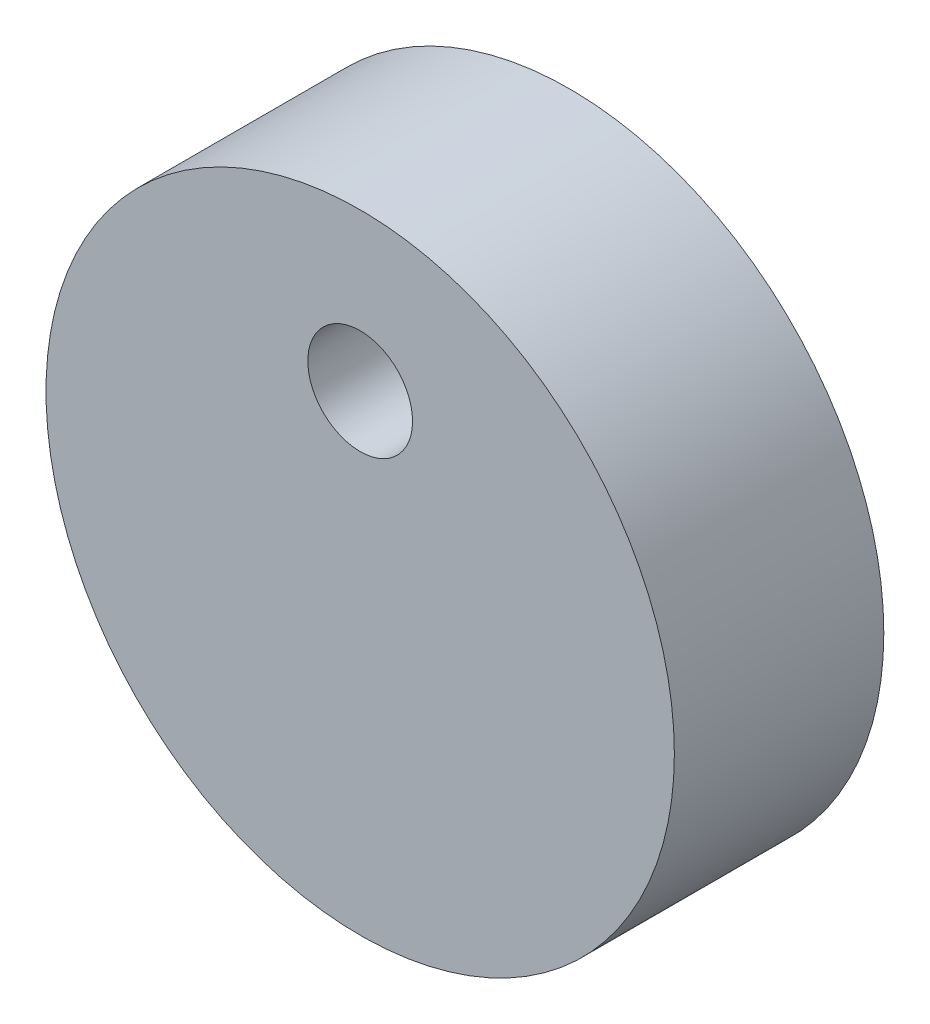
ISO-10303-21;
HEADER;
FILE_DESCRIPTION(('STEP AP214'),'2;1');
FILE_NAME('part.step','',(''),(''),'','','');
FILE_SCHEMA(('AUTOMOTIVE_DESIGN { 1 0 10303 214 1 1 1 1 }'));
ENDSEC;
DATA;
#1=APPLICATION_CONTEXT('core data for automotive mechanical design processes');
#2=APPLICATION_PROTOCOL_DEFINITION('international standard','automotive_design',2000,#1);
#3=PRODUCT_CONTEXT('',#1,'mechanical');
#4=PRODUCT('Part','Part','',(#3));
#5=PRODUCT_RELATED_PRODUCT_CATEGORY('part','',(#4));
#6=PRODUCT_DEFINITION_FORMATION('','',#4);
#7=PRODUCT_DEFINITION_CONTEXT('part definition',#1,'design');
#8=PRODUCT_DEFINITION('design','',#6,#7);
#9=PRODUCT_DEFINITION_SHAPE('','',#8);
#10=(LENGTH_UNIT() NAMED_UNIT(*) SI_UNIT(.MILLI.,.METRE.));
#11=(NAMED_UNIT(*) PLANE_ANGLE_UNIT() SI_UNIT($,.RADIAN.));
#12=(NAMED_UNIT(*) SI_UNIT($,.STERADIAN.) SOLID_ANGLE_UNIT());
#13=UNCERTAINTY_MEASURE_WITH_UNIT(LENGTH_MEASURE(1.E-05),#10,'distance_accuracy_value','');
#14=(GEOMETRIC_REPRESENTATION_CONTEXT(3) GLOBAL_UNCERTAINTY_ASSIGNED_CONTEXT((#13)) GLOBAL_UNIT_ASSIGNED_CONTEXT((#10,
#11,#12)) REPRESENTATION_CONTEXT('',''));
#15=CARTESIAN_POINT('',(0.,0.,0.));
#16=DIRECTION('',(0.,0.,1.));
#17=DIRECTION('',(1.,0.,0.));
#18=AXIS2_PLACEMENT_3D('',#15,#16,#17);
#19=CARTESIAN_POINT('',(0.,0.,25.4));
#20=DIRECTION('',(0.,0.,-1.));
#21=DIRECTION('',(-1.,0.,0.));
#22=AXIS2_PLACEMENT_3D('',#19,#20,#21);
#23=CYLINDRICAL_SURFACE('',#22,38.1);
#24=CARTESIAN_POINT('',(0.,0.,25.4));
#25=DIRECTION('',(0.,0.,1.));
#26=DIRECTION('',(1.,0.,0.));
#27=AXIS2_PLACEMENT_3D('',#24,#25,#26);
#28=CIRCLE('',#27,38.1);
#29=CARTESIAN_POINT('',(38.1,0.,25.4));
#30=VERTEX_POINT('',#29);
#31=EDGE_CURVE('E10',#30,#30,#28,.T.);
#32=ORIENTED_EDGE('',*,*,#31,.F.);
#33=EDGE_LOOP('',(#32));
#34=FACE_BOUND('',#33,.T.);
#35=CARTESIAN_POINT('',(0.,0.,0.));
#36=DIRECTION('',(0.,0.,1.));
#37=DIRECTION('',(1.,0.,0.));
#38=AXIS2_PLACEMENT_3D('',#35,#36,#37);
#39=CIRCLE('',#38,38.1);
#40=CARTESIAN_POINT('',(38.1,0.,0.));
#41=VERTEX_POINT('',#40);
#42=EDGE_CURVE('E40',#41,#41,#39,.T.);
#43=ORIENTED_EDGE('',*,*,#42,.T.);
#44=EDGE_LOOP('',(#43));
#45=FACE_BOUND('',#44,.T.);
#46=ADVANCED_FACE('F33',(#34,#45),#23,.T.);
#47=CARTESIAN_POINT('',(0.,0.,25.4));
#48=DIRECTION('',(0.,0.,1.));
#49=DIRECTION('',(1.,0.,0.));
#50=AXIS2_PLACEMENT_3D('',#47,#48,#49);
#51=PLANE('',#50);
#52=CARTESIAN_POINT('',(0.,19.05,25.4));
#53=DIRECTION('',(0.,0.,1.));
#54=DIRECTION('',(1.,0.,0.));
#55=AXIS2_PLACEMENT_3D('',#52,#53,#54);
#56=CIRCLE('',#55,6.35);
#57=CARTESIAN_POINT('',(6.35,19.05,25.4));
#58=VERTEX_POINT('',#57);
#59=EDGE_CURVE('E46',#58,#58,#56,.T.);
#60=ORIENTED_EDGE('',*,*,#59,.F.);
#61=EDGE_LOOP('',(#60));
#62=FACE_BOUND('',#61,.T.);
#63=ORIENTED_EDGE('',*,*,#31,.T.);
#64=EDGE_LOOP('',(#63));
#65=FACE_BOUND('',#64,.T.);
#66=ADVANCED_FACE('F62',(#62,#65),#51,.T.);
#67=CARTESIAN_POINT('',(0.,0.,0.));
#68=DIRECTION('',(0.,0.,1.));
#69=DIRECTION('',(1.,0.,0.));
#70=AXIS2_PLACEMENT_3D('',#67,#68,#69);
#71=PLANE('',#70);
#72=CARTESIAN_POINT('',(0.,19.05,0.));
#73=DIRECTION('',(0.,0.,1.));
#74=DIRECTION('',(1.,0.,0.));
#75=AXIS2_PLACEMENT_3D('',#72,#73,#74);
#76=CIRCLE('',#75,6.35);
#77=CARTESIAN_POINT('',(6.35,19.05,0.));
#78=VERTEX_POINT('',#77);
#79=EDGE_CURVE('E36',#78,#78,#76,.T.);
#80=ORIENTED_EDGE('',*,*,#79,.T.);
#81=EDGE_LOOP('',(#80));
#82=FACE_BOUND('',#81,.T.);
#83=ORIENTED_EDGE('',*,*,#42,.F.);
#84=EDGE_LOOP('',(#83));
#85=FACE_BOUND('',#84,.T.);
#86=ADVANCED_FACE('F53',(#82,#85),#71,.F.);
#87=CARTESIAN_POINT('',(0.,19.05,-50.8));
#88=DIRECTION('',(0.,0.,1.));
#89=DIRECTION('',(1.,0.,0.));
#90=AXIS2_PLACEMENT_3D('',#87,#88,#89);
#91=CYLINDRICAL_SURFACE('',#90,6.35);
#92=CARTESIAN_POINT('',(6.35,19.05,25.4));
#93=CARTESIAN_POINT('',(6.35,19.05,25.1354166666667));
#94=CARTESIAN_POINT('',(6.35,19.05,24.8708333333333));
#95=CARTESIAN_POINT('',(6.35,19.05,24.3416666666667));
#96=CARTESIAN_POINT('',(6.35,19.05,24.0770833333333));
#97=CARTESIAN_POINT('',(6.35,19.05,23.5479166666667));
#98=CARTESIAN_POINT('',(6.35,19.05,23.2833333333333));
#99=CARTESIAN_POINT('',(6.35,19.05,22.7541666666667));
#100=CARTESIAN_POINT('',(6.35,19.05,22.4895833333333));
#101=CARTESIAN_POINT('',(6.35,19.05,21.9604166666667));
#102=CARTESIAN_POINT('',(6.35,19.05,21.6958333333333));
#103=CARTESIAN_POINT('',(6.35,19.05,21.1666666666667));
#104=CARTESIAN_POINT('',(6.35,19.05,20.9020833333333));
#105=CARTESIAN_POINT('',(6.35,19.05,20.3729166666667));
#106=CARTESIAN_POINT('',(6.35,19.05,20.1083333333333));
#107=CARTESIAN_POINT('',(6.35,19.05,19.5791666666667));
#108=CARTESIAN_POINT('',(6.35,19.05,19.3145833333333));
#109=CARTESIAN_POINT('',(6.35,19.05,18.7854166666667));
#110=CARTESIAN_POINT('',(6.35,19.05,18.5208333333333));
#111=CARTESIAN_POINT('',(6.35,19.05,17.9916666666667));
#112=CARTESIAN_POINT('',(6.35,19.05,17.7270833333333));
#113=CARTESIAN_POINT('',(6.35,19.05,17.1979166666667));
#114=CARTESIAN_POINT('',(6.35,19.05,16.9333333333333));
#115=CARTESIAN_POINT('',(6.35,19.05,16.4041666666667));
#116=CARTESIAN_POINT('',(6.35,19.05,16.1395833333333));
#117=CARTESIAN_POINT('',(6.35,19.05,15.6104166666667));
#118=CARTESIAN_POINT('',(6.35,19.05,15.3458333333333));
#119=CARTESIAN_POINT('',(6.35,19.05,14.8166666666667));
#120=CARTESIAN_POINT('',(6.35,19.05,14.5520833333333));
#121=CARTESIAN_POINT('',(6.35,19.05,14.0229166666667));
#122=CARTESIAN_POINT('',(6.35,19.05,13.7583333333333));
#123=CARTESIAN_POINT('',(6.35,19.05,13.2291666666667));
#124=CARTESIAN_POINT('',(6.35,19.05,12.9645833333333));
#125=CARTESIAN_POINT('',(6.35,19.05,12.4354166666667));
#126=CARTESIAN_POINT('',(6.35,19.05,12.1708333333333));
#127=CARTESIAN_POINT('',(6.35,19.05,11.6416666666667));
#128=CARTESIAN_POINT('',(6.35,19.05,11.3770833333333));
#129=CARTESIAN_POINT('',(6.35,19.05,10.8479166666667));
#130=CARTESIAN_POINT('',(6.35,19.05,10.5833333333333));
#131=CARTESIAN_POINT('',(6.35,19.05,10.0541666666667));
#132=CARTESIAN_POINT('',(6.35,19.05,9.78958333333334));
#133=CARTESIAN_POINT('',(6.35,19.05,9.26041666666667));
#134=CARTESIAN_POINT('',(6.35,19.05,8.99583333333334));
#135=CARTESIAN_POINT('',(6.35,19.05,8.46666666666667));
#136=CARTESIAN_POINT('',(6.35,19.05,8.20208333333333));
#137=CARTESIAN_POINT('',(6.35,19.05,7.67291666666667));
#138=CARTESIAN_POINT('',(6.35,19.05,7.40833333333334));
#139=CARTESIAN_POINT('',(6.35,19.05,6.87916666666667));
#140=CARTESIAN_POINT('',(6.35,19.05,6.61458333333334));
#141=CARTESIAN_POINT('',(6.35,19.05,6.08541666666667));
#142=CARTESIAN_POINT('',(6.35,19.05,5.82083333333333));
#143=CARTESIAN_POINT('',(6.35,19.05,5.29166666666667));
#144=CARTESIAN_POINT('',(6.35,19.05,5.02708333333333));
#145=CARTESIAN_POINT('',(6.35,19.05,4.49791666666667));
#146=CARTESIAN_POINT('',(6.35,19.05,4.23333333333333));
#147=CARTESIAN_POINT('',(6.35,19.05,3.70416666666667));
#148=CARTESIAN_POINT('',(6.35,19.05,3.43958333333333));
#149=CARTESIAN_POINT('',(6.35,19.05,2.91041666666667));
#150=CARTESIAN_POINT('',(6.35,19.05,2.64583333333333));
#151=CARTESIAN_POINT('',(6.35,19.05,2.11666666666667));
#152=CARTESIAN_POINT('',(6.35,19.05,1.85208333333333));
#153=CARTESIAN_POINT('',(6.35,19.05,1.32291666666666));
#154=CARTESIAN_POINT('',(6.35,19.05,1.05833333333333));
#155=CARTESIAN_POINT('',(6.35,19.05,0.529166666666664));
#156=CARTESIAN_POINT('',(6.35,19.05,0.264583333333332));
#157=CARTESIAN_POINT('',(6.35,19.05,0.));
#158=B_SPLINE_CURVE_WITH_KNOTS('',3,(#92,#93,#94,#95,#96,#97,#98,#99,#100,#101,#102,#103,#104,
#105,#106,#107,#108,#109,#110,#111,#112,#113,#114,#115,#116,#117,#118,#119,#120,#121,#122,#123,
#124,#125,#126,#127,#128,#129,#130,#131,#132,#133,#134,#135,#136,#137,#138,#139,#140,#141,#142,
#143,#144,#145,#146,#147,#148,#149,#150,#151,#152,#153,#154,#155,#156,#157),.UNSPECIFIED.,.F.,
.F.,(4,2,2,2,2,2,2,2,2,2,2,2,2,2,2,2,2,2,2,2,2,2,2,2,2,2,2,2,2,2,2,2,4),(0.,0.793749999999996,
1.58750000000001,2.38125,3.175,3.96875000000001,4.7625,5.55625,6.34999999999999,7.14375,7.9375,
8.73125,9.52500000000001,10.31875,11.1125,11.90625,12.7,13.49375,14.2875,15.08125,15.875,
16.66875,17.4625,18.25625,19.05,19.84375,20.6375,21.43125,22.225,23.01875,23.8125,24.60625,
25.4),.UNSPECIFIED.);
#159=EDGE_CURVE('BSEAM56',#58,#78,#158,.T.);
#160=ORIENTED_EDGE('',*,*,#59,.T.);
#161=ORIENTED_EDGE('',*,*,#79,.F.);
#162=ORIENTED_EDGE('',*,*,#159,.T.);
#163=ORIENTED_EDGE('',*,*,#159,.F.);
#164=EDGE_LOOP('',(#160,#162,#161,#163));
#165=FACE_BOUND('',#164,.T.);
#166=ADVANCED_FACE('F56',(#165),#91,.F.);
#167=CLOSED_SHELL('',(#46,#66,#86,#166));
#168=MANIFOLD_SOLID_BREP('B2',#167);
#169=ADVANCED_BREP_SHAPE_REPRESENTATION('',(#18,#168),#14);
#170=SHAPE_DEFINITION_REPRESENTATION(#9,#169);
ENDSEC;
END-ISO-10303-21;
